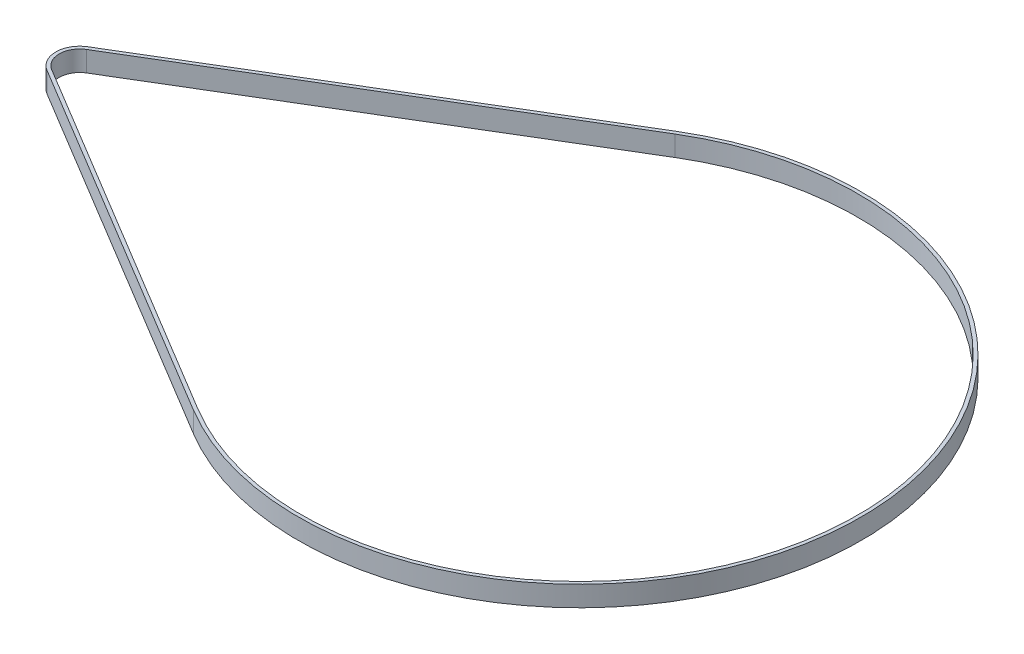
ISO-10303-21;
HEADER;
FILE_DESCRIPTION(('STEP AP214'),'2;1');
FILE_NAME('part.step','',(''),(''),'','','');
FILE_SCHEMA(('AUTOMOTIVE_DESIGN { 1 0 10303 214 1 1 1 1 }'));
ENDSEC;
DATA;
#1=APPLICATION_CONTEXT('core data for automotive mechanical design processes');
#2=APPLICATION_PROTOCOL_DEFINITION('international standard','automotive_design',2000,#1);
#3=PRODUCT_CONTEXT('',#1,'mechanical');
#4=PRODUCT('Part','Part','',(#3));
#5=PRODUCT_RELATED_PRODUCT_CATEGORY('part','',(#4));
#6=PRODUCT_DEFINITION_FORMATION('','',#4);
#7=PRODUCT_DEFINITION_CONTEXT('part definition',#1,'design');
#8=PRODUCT_DEFINITION('design','',#6,#7);
#9=PRODUCT_DEFINITION_SHAPE('','',#8);
#10=(LENGTH_UNIT() NAMED_UNIT(*) SI_UNIT(.MILLI.,.METRE.));
#11=(NAMED_UNIT(*) PLANE_ANGLE_UNIT() SI_UNIT($,.RADIAN.));
#12=(NAMED_UNIT(*) SI_UNIT($,.STERADIAN.) SOLID_ANGLE_UNIT());
#13=UNCERTAINTY_MEASURE_WITH_UNIT(LENGTH_MEASURE(1.E-05),#10,'distance_accuracy_value','');
#14=(GEOMETRIC_REPRESENTATION_CONTEXT(3) GLOBAL_UNCERTAINTY_ASSIGNED_CONTEXT((#13)) GLOBAL_UNIT_ASSIGNED_CONTEXT((#10,
#11,#12)) REPRESENTATION_CONTEXT('',''));
#15=CARTESIAN_POINT('',(0.,0.,0.));
#16=DIRECTION('',(0.,0.,1.));
#17=DIRECTION('',(1.,0.,0.));
#18=AXIS2_PLACEMENT_3D('',#15,#16,#17);
#19=CARTESIAN_POINT('',(-73.5331410735953,6.,0.));
#20=DIRECTION('',(0.,1.,0.));
#21=DIRECTION('',(0.,0.,1.));
#22=AXIS2_PLACEMENT_3D('',#19,#20,#21);
#23=PLANE('',#22);
#24=CARTESIAN_POINT('',(-73.5331410735953,6.,0.));
#25=DIRECTION('',(0.,1.,0.));
#26=DIRECTION('',(0.,0.,1.));
#27=AXIS2_PLACEMENT_3D('',#24,#25,#26);
#28=CIRCLE('',#27,7.);
#29=CARTESIAN_POINT('',(-77.1413065840888,6.,-5.99842826487782));
#30=VERTEX_POINT('',#29);
#31=CARTESIAN_POINT('',(-77.1413065840888,6.,5.99842826487782));
#32=VERTEX_POINT('',#31);
#33=EDGE_CURVE('E138',#30,#32,#28,.T.);
#34=ORIENTED_EDGE('',*,*,#33,.T.);
#35=DIRECTION('',(0.856918323553974,0.,0.515452215784787));
#36=VECTOR('',#35,1.);
#37=CARTESIAN_POINT('',(-77.1413065840888,6.,5.99842826487782));
#38=LINE('',#37,#36);
#39=CARTESIAN_POINT('',(30.8507899406657,6.,70.9576710665323));
#40=VERTEX_POINT('',#39);
#41=EDGE_CURVE('E141',#32,#40,#38,.T.);
#42=ORIENTED_EDGE('',*,*,#41,.T.);
#43=CARTESIAN_POINT('',(73.5331410735953,6.,0.));
#44=DIRECTION('',(0.,1.,0.));
#45=DIRECTION('',(0.,0.,1.));
#46=AXIS2_PLACEMENT_3D('',#43,#44,#45);
#47=CIRCLE('',#46,82.805641);
#48=CARTESIAN_POINT('',(30.8507899406657,6.,-70.9576710665323));
#49=VERTEX_POINT('',#48);
#50=EDGE_CURVE('E144',#40,#49,#47,.T.);
#51=ORIENTED_EDGE('',*,*,#50,.T.);
#52=DIRECTION('',(-0.856918323553974,0.,0.515452215784787));
#53=VECTOR('',#52,1.);
#54=CARTESIAN_POINT('',(-77.1413065840888,6.,-5.99842826487782));
#55=LINE('',#54,#53);
#56=EDGE_CURVE('E146',#49,#30,#55,.T.);
#57=ORIENTED_EDGE('',*,*,#56,.T.);
#58=EDGE_LOOP('',(#34,#42,#51,#57));
#59=FACE_BOUND('',#58,.T.);
#60=DIRECTION('',(0.856918323553975,0.,0.515452215784786));
#61=VECTOR('',#60,1.);
#62=CARTESIAN_POINT('',(31.3662421564506,6.,70.1007527429782));
#63=LINE('',#62,#61);
#64=CARTESIAN_POINT('',(-76.625854368304,6.,5.14150994132385));
#65=VERTEX_POINT('',#64);
#66=CARTESIAN_POINT('',(31.3662421564505,6.,70.1007527429783));
#67=VERTEX_POINT('',#66);
#68=EDGE_CURVE('E110',#65,#67,#63,.T.);
#69=ORIENTED_EDGE('',*,*,#68,.F.);
#70=CARTESIAN_POINT('',(-73.5331410735953,6.,0.));
#71=DIRECTION('',(0.,1.,0.));
#72=DIRECTION('',(0.,0.,-1.));
#73=AXIS2_PLACEMENT_3D('',#70,#71,#72);
#74=CIRCLE('',#73,6.);
#75=CARTESIAN_POINT('',(-76.625854368304,6.,-5.14150994132384));
#76=VERTEX_POINT('',#75);
#77=EDGE_CURVE('E102',#76,#65,#74,.T.);
#78=ORIENTED_EDGE('',*,*,#77,.F.);
#79=DIRECTION('',(-0.856918323553974,0.,0.515452215784787));
#80=VECTOR('',#79,1.);
#81=CARTESIAN_POINT('',(-76.625854368304,6.,-5.14150994132384));
#82=LINE('',#81,#80);
#83=CARTESIAN_POINT('',(31.3662421564505,6.,-70.1007527429783));
#84=VERTEX_POINT('',#83);
#85=EDGE_CURVE('E124',#84,#76,#82,.T.);
#86=ORIENTED_EDGE('',*,*,#85,.F.);
#87=CARTESIAN_POINT('',(73.5331410735953,6.,0.));
#88=DIRECTION('',(0.,1.,0.));
#89=DIRECTION('',(0.,0.,1.));
#90=AXIS2_PLACEMENT_3D('',#87,#88,#89);
#91=CIRCLE('',#90,81.805641);
#92=EDGE_CURVE('E122',#67,#84,#91,.T.);
#93=ORIENTED_EDGE('',*,*,#92,.F.);
#94=EDGE_LOOP('',(#69,#78,#86,#93));
#95=FACE_BOUND('',#94,.T.);
#96=ADVANCED_FACE('F37',(#59,#95),#23,.T.);
#97=CARTESIAN_POINT('',(-73.5331410735953,0.,0.));
#98=DIRECTION('',(0.,1.,0.));
#99=DIRECTION('',(0.,0.,1.));
#100=AXIS2_PLACEMENT_3D('',#97,#98,#99);
#101=PLANE('',#100);
#102=CARTESIAN_POINT('',(-73.5331410735953,0.,0.));
#103=DIRECTION('',(0.,1.,0.));
#104=DIRECTION('',(0.,0.,1.));
#105=AXIS2_PLACEMENT_3D('',#102,#103,#104);
#106=CIRCLE('',#105,7.);
#107=CARTESIAN_POINT('',(-77.1413065840888,0.,-5.99842826487782));
#108=VERTEX_POINT('',#107);
#109=CARTESIAN_POINT('',(-77.1413065840888,0.,5.99842826487782));
#110=VERTEX_POINT('',#109);
#111=EDGE_CURVE('E118',#108,#110,#106,.T.);
#112=ORIENTED_EDGE('',*,*,#111,.F.);
#113=DIRECTION('',(-0.856918323553974,0.,0.515452215784787));
#114=VECTOR('',#113,1.);
#115=CARTESIAN_POINT('',(-77.1413065840888,0.,-5.99842826487782));
#116=LINE('',#115,#114);
#117=CARTESIAN_POINT('',(30.8507899406657,0.,-70.9576710665323));
#118=VERTEX_POINT('',#117);
#119=EDGE_CURVE('E142',#118,#108,#116,.T.);
#120=ORIENTED_EDGE('',*,*,#119,.F.);
#121=CARTESIAN_POINT('',(73.5331410735953,0.,0.));
#122=DIRECTION('',(0.,1.,0.));
#123=DIRECTION('',(0.,0.,1.));
#124=AXIS2_PLACEMENT_3D('',#121,#122,#123);
#125=CIRCLE('',#124,82.805641);
#126=CARTESIAN_POINT('',(30.8507899406657,0.,70.9576710665323));
#127=VERTEX_POINT('',#126);
#128=EDGE_CURVE('E153',#127,#118,#125,.T.);
#129=ORIENTED_EDGE('',*,*,#128,.F.);
#130=DIRECTION('',(0.856918323553974,0.,0.515452215784787));
#131=VECTOR('',#130,1.);
#132=CARTESIAN_POINT('',(-77.1413065840888,0.,5.99842826487782));
#133=LINE('',#132,#131);
#134=EDGE_CURVE('E151',#110,#127,#133,.T.);
#135=ORIENTED_EDGE('',*,*,#134,.F.);
#136=EDGE_LOOP('',(#112,#120,#129,#135));
#137=FACE_BOUND('',#136,.T.);
#138=CARTESIAN_POINT('',(-73.5331410735953,0.,0.));
#139=DIRECTION('',(0.,1.,0.));
#140=DIRECTION('',(0.,0.,-1.));
#141=AXIS2_PLACEMENT_3D('',#138,#139,#140);
#142=CIRCLE('',#141,6.);
#143=CARTESIAN_POINT('',(-76.625854368304,0.,-5.14150994132384));
#144=VERTEX_POINT('',#143);
#145=CARTESIAN_POINT('',(-76.625854368304,0.,5.14150994132385));
#146=VERTEX_POINT('',#145);
#147=EDGE_CURVE('E60',#144,#146,#142,.T.);
#148=ORIENTED_EDGE('',*,*,#147,.T.);
#149=DIRECTION('',(0.856918323553975,0.,0.515452215784786));
#150=VECTOR('',#149,1.);
#151=CARTESIAN_POINT('',(31.3662421564506,0.,70.1007527429782));
#152=LINE('',#151,#150);
#153=CARTESIAN_POINT('',(31.3662421564505,0.,70.1007527429783));
#154=VERTEX_POINT('',#153);
#155=EDGE_CURVE('E117',#146,#154,#152,.T.);
#156=ORIENTED_EDGE('',*,*,#155,.T.);
#157=CARTESIAN_POINT('',(73.5331410735953,0.,0.));
#158=DIRECTION('',(0.,1.,0.));
#159=DIRECTION('',(0.,0.,1.));
#160=AXIS2_PLACEMENT_3D('',#157,#158,#159);
#161=CIRCLE('',#160,81.805641);
#162=CARTESIAN_POINT('',(31.3662421564505,0.,-70.1007527429783));
#163=VERTEX_POINT('',#162);
#164=EDGE_CURVE('E130',#154,#163,#161,.T.);
#165=ORIENTED_EDGE('',*,*,#164,.T.);
#166=DIRECTION('',(-0.856918323553974,0.,0.515452215784787));
#167=VECTOR('',#166,1.);
#168=CARTESIAN_POINT('',(-76.625854368304,0.,-5.14150994132384));
#169=LINE('',#168,#167);
#170=EDGE_CURVE('E111',#163,#144,#169,.T.);
#171=ORIENTED_EDGE('',*,*,#170,.T.);
#172=EDGE_LOOP('',(#148,#156,#165,#171));
#173=FACE_BOUND('',#172,.T.);
#174=ADVANCED_FACE('F171',(#137,#173),#101,.F.);
#175=CARTESIAN_POINT('',(-73.5331410735953,6.,0.));
#176=DIRECTION('',(0.,-1.,0.));
#177=DIRECTION('',(0.,0.,-1.));
#178=AXIS2_PLACEMENT_3D('',#175,#176,#177);
#179=CYLINDRICAL_SURFACE('',#178,7.);
#180=ORIENTED_EDGE('',*,*,#111,.T.);
#181=DIRECTION('',(0.,-1.,0.));
#182=VECTOR('',#181,1.);
#183=CARTESIAN_POINT('',(-77.1413065840888,6.,5.99842826487782));
#184=LINE('',#183,#182);
#185=EDGE_CURVE('E11',#32,#110,#184,.T.);
#186=ORIENTED_EDGE('',*,*,#185,.F.);
#187=ORIENTED_EDGE('',*,*,#33,.F.);
#188=DIRECTION('',(0.,-1.,0.));
#189=VECTOR('',#188,1.);
#190=CARTESIAN_POINT('',(-77.1413065840888,6.,-5.99842826487782));
#191=LINE('',#190,#189);
#192=EDGE_CURVE('E148',#30,#108,#191,.T.);
#193=ORIENTED_EDGE('',*,*,#192,.T.);
#194=EDGE_LOOP('',(#180,#186,#187,#193));
#195=FACE_BOUND('',#194,.T.);
#196=ADVANCED_FACE('F39',(#195),#179,.T.);
#197=CARTESIAN_POINT('',(-77.1413065840888,6.,5.99842826487782));
#198=DIRECTION('',(0.515452215784786,0.,-0.856918323553974));
#199=DIRECTION('',(-0.856918323553974,0.,-0.515452215784787));
#200=AXIS2_PLACEMENT_3D('',#197,#198,#199);
#201=PLANE('',#200);
#202=ORIENTED_EDGE('',*,*,#134,.T.);
#203=DIRECTION('',(0.,-1.,0.));
#204=VECTOR('',#203,1.);
#205=CARTESIAN_POINT('',(30.8507899406657,6.,70.9576710665323));
#206=LINE('',#205,#204);
#207=EDGE_CURVE('E45',#40,#127,#206,.T.);
#208=ORIENTED_EDGE('',*,*,#207,.F.);
#209=ORIENTED_EDGE('',*,*,#41,.F.);
#210=ORIENTED_EDGE('',*,*,#185,.T.);
#211=EDGE_LOOP('',(#202,#208,#209,#210));
#212=FACE_BOUND('',#211,.T.);
#213=ADVANCED_FACE('F181',(#212),#201,.F.);
#214=CARTESIAN_POINT('',(73.5331410735953,6.,0.));
#215=DIRECTION('',(0.,-1.,0.));
#216=DIRECTION('',(0.,0.,-1.));
#217=AXIS2_PLACEMENT_3D('',#214,#215,#216);
#218=CYLINDRICAL_SURFACE('',#217,82.805641);
#219=ORIENTED_EDGE('',*,*,#128,.T.);
#220=DIRECTION('',(0.,-1.,0.));
#221=VECTOR('',#220,1.);
#222=CARTESIAN_POINT('',(30.8507899406657,6.,-70.9576710665323));
#223=LINE('',#222,#221);
#224=EDGE_CURVE('E158',#49,#118,#223,.T.);
#225=ORIENTED_EDGE('',*,*,#224,.F.);
#226=ORIENTED_EDGE('',*,*,#50,.F.);
#227=ORIENTED_EDGE('',*,*,#207,.T.);
#228=EDGE_LOOP('',(#219,#225,#226,#227));
#229=FACE_BOUND('',#228,.T.);
#230=ADVANCED_FACE('F165',(#229),#218,.T.);
#231=CARTESIAN_POINT('',(-77.1413065840888,6.,-5.99842826487782));
#232=DIRECTION('',(0.515452215784786,0.,0.856918323553974));
#233=DIRECTION('',(0.856918323553974,0.,-0.515452215784787));
#234=AXIS2_PLACEMENT_3D('',#231,#232,#233);
#235=PLANE('',#234);
#236=ORIENTED_EDGE('',*,*,#119,.T.);
#237=ORIENTED_EDGE('',*,*,#192,.F.);
#238=ORIENTED_EDGE('',*,*,#56,.F.);
#239=ORIENTED_EDGE('',*,*,#224,.T.);
#240=EDGE_LOOP('',(#236,#237,#238,#239));
#241=FACE_BOUND('',#240,.T.);
#242=ADVANCED_FACE('F175',(#241),#235,.F.);
#243=CARTESIAN_POINT('',(-73.5331410735953,6.,0.));
#244=DIRECTION('',(0.,-1.,0.));
#245=DIRECTION('',(0.,0.,-1.));
#246=AXIS2_PLACEMENT_3D('',#243,#244,#245);
#247=CYLINDRICAL_SURFACE('',#246,6.);
#248=ORIENTED_EDGE('',*,*,#147,.F.);
#249=DIRECTION('',(0.,-1.,0.));
#250=VECTOR('',#249,1.);
#251=CARTESIAN_POINT('',(-76.625854368304,6.,-5.14150994132384));
#252=LINE('',#251,#250);
#253=EDGE_CURVE('E106',#76,#144,#252,.T.);
#254=ORIENTED_EDGE('',*,*,#253,.F.);
#255=ORIENTED_EDGE('',*,*,#77,.T.);
#256=DIRECTION('',(0.,-1.,0.));
#257=VECTOR('',#256,1.);
#258=CARTESIAN_POINT('',(-76.625854368304,6.,5.14150994132385));
#259=LINE('',#258,#257);
#260=EDGE_CURVE('E105',#65,#146,#259,.T.);
#261=ORIENTED_EDGE('',*,*,#260,.T.);
#262=EDGE_LOOP('',(#248,#254,#255,#261));
#263=FACE_BOUND('',#262,.T.);
#264=ADVANCED_FACE('F104',(#263),#247,.F.);
#265=CARTESIAN_POINT('',(31.3662421564506,6.,70.1007527429782));
#266=DIRECTION('',(0.515452215784786,0.,-0.856918323553974));
#267=DIRECTION('',(-0.856918323553975,0.,-0.515452215784786));
#268=AXIS2_PLACEMENT_3D('',#265,#266,#267);
#269=PLANE('',#268);
#270=ORIENTED_EDGE('',*,*,#155,.F.);
#271=ORIENTED_EDGE('',*,*,#260,.F.);
#272=ORIENTED_EDGE('',*,*,#68,.T.);
#273=DIRECTION('',(0.,-1.,0.));
#274=VECTOR('',#273,1.);
#275=CARTESIAN_POINT('',(31.3662421564505,6.,70.1007527429783));
#276=LINE('',#275,#274);
#277=EDGE_CURVE('E119',#67,#154,#276,.T.);
#278=ORIENTED_EDGE('',*,*,#277,.T.);
#279=EDGE_LOOP('',(#270,#271,#272,#278));
#280=FACE_BOUND('',#279,.T.);
#281=ADVANCED_FACE('F114',(#280),#269,.T.);
#282=CARTESIAN_POINT('',(73.5331410735953,6.,0.));
#283=DIRECTION('',(0.,-1.,0.));
#284=DIRECTION('',(0.,0.,-1.));
#285=AXIS2_PLACEMENT_3D('',#282,#283,#284);
#286=CYLINDRICAL_SURFACE('',#285,81.805641);
#287=ORIENTED_EDGE('',*,*,#164,.F.);
#288=ORIENTED_EDGE('',*,*,#277,.F.);
#289=ORIENTED_EDGE('',*,*,#92,.T.);
#290=DIRECTION('',(0.,-1.,0.));
#291=VECTOR('',#290,1.);
#292=CARTESIAN_POINT('',(31.3662421564505,6.,-70.1007527429783));
#293=LINE('',#292,#291);
#294=EDGE_CURVE('E52',#84,#163,#293,.T.);
#295=ORIENTED_EDGE('',*,*,#294,.T.);
#296=EDGE_LOOP('',(#287,#288,#289,#295));
#297=FACE_BOUND('',#296,.T.);
#298=ADVANCED_FACE('F204',(#297),#286,.F.);
#299=CARTESIAN_POINT('',(-76.625854368304,6.,-5.14150994132384));
#300=DIRECTION('',(0.515452215784787,0.,0.856918323553974));
#301=DIRECTION('',(0.856918323553974,0.,-0.515452215784787));
#302=AXIS2_PLACEMENT_3D('',#299,#300,#301);
#303=PLANE('',#302);
#304=ORIENTED_EDGE('',*,*,#170,.F.);
#305=ORIENTED_EDGE('',*,*,#294,.F.);
#306=ORIENTED_EDGE('',*,*,#85,.T.);
#307=ORIENTED_EDGE('',*,*,#253,.T.);
#308=EDGE_LOOP('',(#304,#305,#306,#307));
#309=FACE_BOUND('',#308,.T.);
#310=ADVANCED_FACE('F208',(#309),#303,.T.);
#311=CLOSED_SHELL('',(#96,#174,#196,#213,#230,#242,#264,#281,#298,#310));
#312=MANIFOLD_SOLID_BREP('B2',#311);
#313=ADVANCED_BREP_SHAPE_REPRESENTATION('',(#18,#312),#14);
#314=SHAPE_DEFINITION_REPRESENTATION(#9,#313);
ENDSEC;
END-ISO-10303-21;
